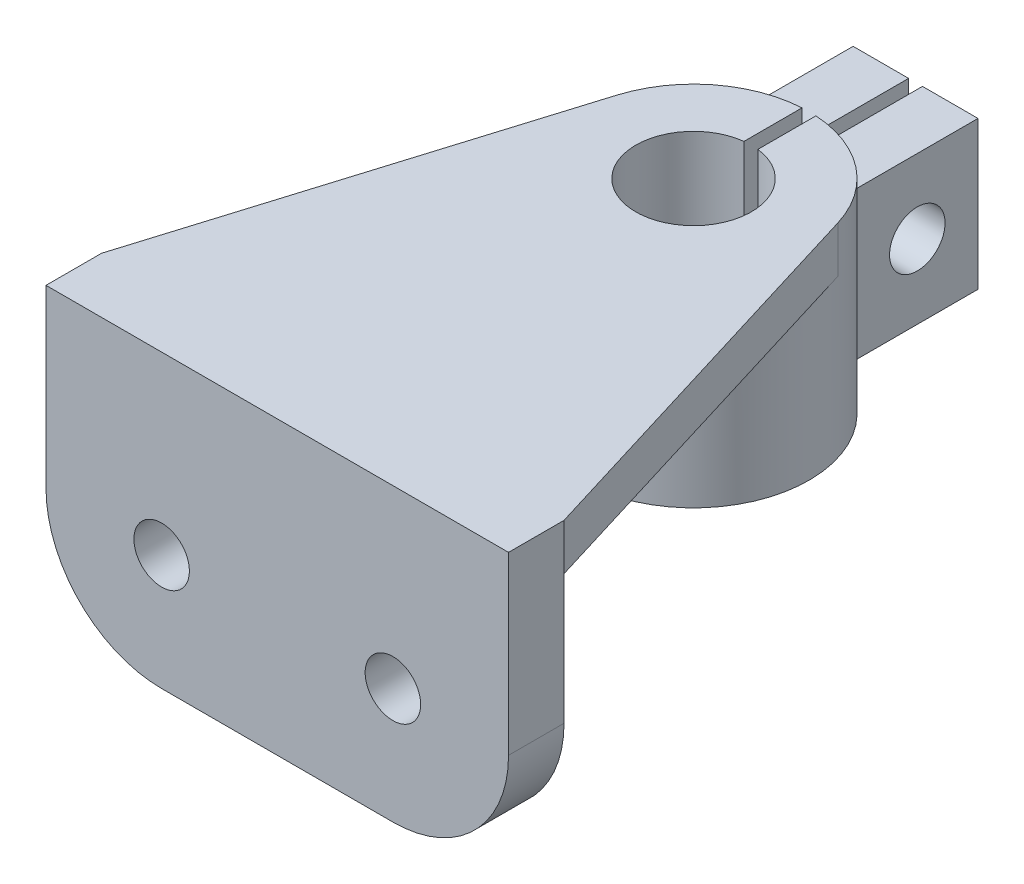
ISO-10303-21;
HEADER;
FILE_DESCRIPTION(('STEP AP214'),'2;1');
FILE_NAME('part.step','',(''),(''),'','','');
FILE_SCHEMA(('AUTOMOTIVE_DESIGN { 1 0 10303 214 1 1 1 1 }'));
ENDSEC;
DATA;
#1=APPLICATION_CONTEXT('core data for automotive mechanical design processes');
#2=APPLICATION_PROTOCOL_DEFINITION('international standard','automotive_design',2000,#1);
#3=PRODUCT_CONTEXT('',#1,'mechanical');
#4=PRODUCT('Part','Part','',(#3));
#5=PRODUCT_RELATED_PRODUCT_CATEGORY('part','',(#4));
#6=PRODUCT_DEFINITION_FORMATION('','',#4);
#7=PRODUCT_DEFINITION_CONTEXT('part definition',#1,'design');
#8=PRODUCT_DEFINITION('design','',#6,#7);
#9=PRODUCT_DEFINITION_SHAPE('','',#8);
#10=(LENGTH_UNIT() NAMED_UNIT(*) SI_UNIT(.MILLI.,.METRE.));
#11=(NAMED_UNIT(*) PLANE_ANGLE_UNIT() SI_UNIT($,.RADIAN.));
#12=(NAMED_UNIT(*) SI_UNIT($,.STERADIAN.) SOLID_ANGLE_UNIT());
#13=UNCERTAINTY_MEASURE_WITH_UNIT(LENGTH_MEASURE(1.E-05),#10,'distance_accuracy_value','');
#14=(GEOMETRIC_REPRESENTATION_CONTEXT(3) GLOBAL_UNCERTAINTY_ASSIGNED_CONTEXT((#13)) GLOBAL_UNIT_ASSIGNED_CONTEXT((#10,
#11,#12)) REPRESENTATION_CONTEXT('',''));
#15=CARTESIAN_POINT('',(0.,0.,0.));
#16=DIRECTION('',(0.,0.,1.));
#17=DIRECTION('',(1.,0.,0.));
#18=AXIS2_PLACEMENT_3D('',#15,#16,#17);
#19=CARTESIAN_POINT('',(0.,21.5,0.));
#20=DIRECTION('',(0.,1.,0.));
#21=DIRECTION('',(-1.,0.,0.));
#22=AXIS2_PLACEMENT_3D('',#19,#20,#21);
#23=PLANE('',#22);
#24=DIRECTION('',(0.,0.,1.));
#25=VECTOR('',#24,1.);
#26=CARTESIAN_POINT('',(2.5,21.5,0.));
#27=LINE('',#26,#25);
#28=CARTESIAN_POINT('',(2.5,21.5,-53.1253140723345));
#29=VERTEX_POINT('',#28);
#30=CARTESIAN_POINT('',(2.5,21.5,0.));
#31=VERTEX_POINT('',#30);
#32=EDGE_CURVE('E241',#29,#31,#27,.T.);
#33=ORIENTED_EDGE('',*,*,#32,.F.);
#34=CARTESIAN_POINT('',(0.,21.5,-78.));
#35=DIRECTION('',(0.,1.,0.));
#36=DIRECTION('',(-1.,0.,0.));
#37=AXIS2_PLACEMENT_3D('',#34,#35,#36);
#38=CIRCLE('',#37,25.);
#39=CARTESIAN_POINT('',(23.9067793629531,21.5,-85.3120380531751));
#40=VERTEX_POINT('',#39);
#41=EDGE_CURVE('E420',#29,#40,#38,.T.);
#42=ORIENTED_EDGE('',*,*,#41,.T.);
#43=DIRECTION('',(0.292481522127003,0.,0.956271174518124));
#44=VECTOR('',#43,1.);
#45=CARTESIAN_POINT('',(45.7227279607136,21.5,-13.9845824344619));
#46=LINE('',#45,#44);
#47=CARTESIAN_POINT('',(50.,21.5,0.));
#48=VERTEX_POINT('',#47);
#49=EDGE_CURVE('E345',#40,#48,#46,.T.);
#50=ORIENTED_EDGE('',*,*,#49,.T.);
#51=DIRECTION('',(-1.,0.,0.));
#52=VECTOR('',#51,1.);
#53=CARTESIAN_POINT('',(0.,21.5,0.));
#54=LINE('',#53,#52);
#55=EDGE_CURVE('E342',#48,#31,#54,.T.);
#56=ORIENTED_EDGE('',*,*,#55,.T.);
#57=EDGE_LOOP('',(#33,#42,#50,#56));
#58=FACE_BOUND('',#57,.T.);
#59=ADVANCED_FACE('F35',(#58),#23,.F.);
#60=CARTESIAN_POINT('',(0.,21.5,-78.));
#61=DIRECTION('',(0.,1.,0.));
#62=DIRECTION('',(-1.,0.,0.));
#63=AXIS2_PLACEMENT_3D('',#60,#61,#62);
#64=CYLINDRICAL_SURFACE('',#63,25.);
#65=ORIENTED_EDGE('',*,*,#41,.F.);
#66=DIRECTION('',(0.,1.,0.));
#67=VECTOR('',#66,1.);
#68=CARTESIAN_POINT('',(2.5,21.5,-53.1253140723345));
#69=LINE('',#68,#67);
#70=CARTESIAN_POINT('',(2.5,-12.5,-53.1253140723345));
#71=VERTEX_POINT('',#70);
#72=EDGE_CURVE('E232',#71,#29,#69,.T.);
#73=ORIENTED_EDGE('',*,*,#72,.F.);
#74=CARTESIAN_POINT('',(0.,-12.5,-78.));
#75=DIRECTION('',(0.,1.,0.));
#76=DIRECTION('',(-1.,0.,0.));
#77=AXIS2_PLACEMENT_3D('',#74,#75,#76);
#78=CIRCLE('',#77,25.);
#79=CARTESIAN_POINT('',(1.5,-12.5,-102.954959426936));
#80=VERTEX_POINT('',#79);
#81=EDGE_CURVE('E228',#71,#80,#78,.T.);
#82=ORIENTED_EDGE('',*,*,#81,.T.);
#83=DIRECTION('',(0.,1.,0.));
#84=VECTOR('',#83,1.);
#85=CARTESIAN_POINT('',(1.5,21.5,-102.954959426936));
#86=LINE('',#85,#84);
#87=CARTESIAN_POINT('',(1.5,-6.50000000000001,-102.954959426936));
#88=VERTEX_POINT('',#87);
#89=EDGE_CURVE('E288',#80,#88,#86,.T.);
#90=ORIENTED_EDGE('',*,*,#89,.T.);
#91=CARTESIAN_POINT('',(0.,-6.50000000000001,-78.));
#92=DIRECTION('',(0.,-1.,0.));
#93=DIRECTION('',(1.,0.,0.));
#94=AXIS2_PLACEMENT_3D('',#91,#92,#93);
#95=CIRCLE('',#94,25.);
#96=CARTESIAN_POINT('',(13.5,-6.50000000000001,-99.0416254125008));
#97=VERTEX_POINT('',#96);
#98=EDGE_CURVE('E328',#88,#97,#95,.T.);
#99=ORIENTED_EDGE('',*,*,#98,.T.);
#100=DIRECTION('',(0.,1.,0.));
#101=VECTOR('',#100,1.);
#102=CARTESIAN_POINT('',(13.5,21.5,-99.0416254125008));
#103=LINE('',#102,#101);
#104=CARTESIAN_POINT('',(13.5,25.5,-99.0416254125008));
#105=VERTEX_POINT('',#104);
#106=EDGE_CURVE('E310',#97,#105,#103,.T.);
#107=ORIENTED_EDGE('',*,*,#106,.T.);
#108=CARTESIAN_POINT('',(0.,25.5,-78.));
#109=DIRECTION('',(0.,1.,0.));
#110=DIRECTION('',(-1.,0.,0.));
#111=AXIS2_PLACEMENT_3D('',#108,#109,#110);
#112=CIRCLE('',#111,25.);
#113=CARTESIAN_POINT('',(1.49999999999999,25.5,-102.954959426936));
#114=VERTEX_POINT('',#113);
#115=EDGE_CURVE('E318',#105,#114,#112,.T.);
#116=ORIENTED_EDGE('',*,*,#115,.T.);
#117=CARTESIAN_POINT('',(1.49999999999999,31.5,-102.954959426936));
#118=VERTEX_POINT('',#117);
#119=EDGE_CURVE('E285',#114,#118,#86,.T.);
#120=ORIENTED_EDGE('',*,*,#119,.T.);
#121=CARTESIAN_POINT('',(0.,31.5,-78.));
#122=DIRECTION('',(0.,1.,0.));
#123=DIRECTION('',(-1.,0.,0.));
#124=AXIS2_PLACEMENT_3D('',#121,#122,#123);
#125=CIRCLE('',#124,25.);
#126=CARTESIAN_POINT('',(23.9067793629531,31.5,-85.3120380531751));
#127=VERTEX_POINT('',#126);
#128=EDGE_CURVE('E349',#127,#118,#125,.T.);
#129=ORIENTED_EDGE('',*,*,#128,.F.);
#130=DIRECTION('',(0.,1.,0.));
#131=VECTOR('',#130,1.);
#132=CARTESIAN_POINT('',(23.9067793629531,21.5,-85.3120380531751));
#133=LINE('',#132,#131);
#134=EDGE_CURVE('E357',#40,#127,#133,.T.);
#135=ORIENTED_EDGE('',*,*,#134,.F.);
#136=EDGE_LOOP('',(#65,#73,#82,#90,#99,#107,#116,#120,#129,#135));
#137=FACE_BOUND('',#136,.T.);
#138=ADVANCED_FACE('F464',(#137),#64,.T.);
#139=DIRECTION('',(0.,0.,1.));
#140=VECTOR('',#139,1.);
#141=CARTESIAN_POINT('',(-2.5,21.5,-126.001));
#142=LINE('',#141,#140);
#143=CARTESIAN_POINT('',(-2.5,21.5,-53.1253140723345));
#144=VERTEX_POINT('',#143);
#145=CARTESIAN_POINT('',(-2.5,21.5,0.));
#146=VERTEX_POINT('',#145);
#147=EDGE_CURVE('E239',#144,#146,#142,.T.);
#148=ORIENTED_EDGE('',*,*,#147,.T.);
#149=CARTESIAN_POINT('',(-50.,21.5,0.));
#150=VERTEX_POINT('',#149);
#151=EDGE_CURVE('E340',#146,#150,#54,.T.);
#152=ORIENTED_EDGE('',*,*,#151,.T.);
#153=DIRECTION('',(0.292481522127002,0.,-0.956271174518124));
#154=VECTOR('',#153,1.);
#155=CARTESIAN_POINT('',(-45.7227279607136,21.5,-13.9845824344618));
#156=LINE('',#155,#154);
#157=CARTESIAN_POINT('',(-23.9067793629531,21.5,-85.3120380531751));
#158=VERTEX_POINT('',#157);
#159=EDGE_CURVE('E337',#150,#158,#156,.T.);
#160=ORIENTED_EDGE('',*,*,#159,.T.);
#161=EDGE_CURVE('E421',#158,#144,#38,.T.);
#162=ORIENTED_EDGE('',*,*,#161,.T.);
#163=EDGE_LOOP('',(#148,#152,#160,#162));
#164=FACE_BOUND('',#163,.T.);
#165=ADVANCED_FACE('F467',(#164),#23,.F.);
#166=CARTESIAN_POINT('',(25.,-6.50000000000001,0.));
#167=DIRECTION('',(0.,0.,1.));
#168=DIRECTION('',(1.,0.,0.));
#169=AXIS2_PLACEMENT_3D('',#166,#167,#168);
#170=PLANE('',#169);
#171=CARTESIAN_POINT('',(-25.,-6.50000000000002,0.));
#172=DIRECTION('',(0.,0.,1.));
#173=DIRECTION('',(1.,0.,0.));
#174=AXIS2_PLACEMENT_3D('',#171,#172,#173);
#175=CIRCLE('',#174,6.);
#176=CARTESIAN_POINT('',(-19.,-6.50000000000002,0.));
#177=VERTEX_POINT('',#176);
#178=EDGE_CURVE('E364',#177,#177,#175,.T.);
#179=ORIENTED_EDGE('',*,*,#178,.T.);
#180=EDGE_LOOP('',(#179));
#181=FACE_BOUND('',#180,.T.);
#182=DIRECTION('',(0.,-1.,0.));
#183=VECTOR('',#182,1.);
#184=CARTESIAN_POINT('',(-2.5,-31.5,0.));
#185=LINE('',#184,#183);
#186=CARTESIAN_POINT('',(-2.5,-31.5,0.));
#187=VERTEX_POINT('',#186);
#188=EDGE_CURVE('E245',#146,#187,#185,.T.);
#189=ORIENTED_EDGE('',*,*,#188,.T.);
#190=DIRECTION('',(1.,0.,0.));
#191=VECTOR('',#190,1.);
#192=CARTESIAN_POINT('',(24.9999999999998,-31.5,0.));
#193=LINE('',#192,#191);
#194=CARTESIAN_POINT('',(-24.9999999999998,-31.5,0.));
#195=VERTEX_POINT('',#194);
#196=EDGE_CURVE('E397',#195,#187,#193,.T.);
#197=ORIENTED_EDGE('',*,*,#196,.F.);
#198=CARTESIAN_POINT('',(-25.,-6.50000000000002,0.));
#199=DIRECTION('',(0.,0.,1.));
#200=DIRECTION('',(-1.,0.,0.));
#201=AXIS2_PLACEMENT_3D('',#198,#199,#200);
#202=CIRCLE('',#201,25.);
#203=CARTESIAN_POINT('',(-50.,-6.50000000000002,0.));
#204=VERTEX_POINT('',#203);
#205=EDGE_CURVE('E394',#204,#195,#202,.T.);
#206=ORIENTED_EDGE('',*,*,#205,.F.);
#207=DIRECTION('',(0.,-1.,0.));
#208=VECTOR('',#207,1.);
#209=CARTESIAN_POINT('',(-50.,-6.49999999999984,0.));
#210=LINE('',#209,#208);
#211=EDGE_CURVE('E367',#150,#204,#210,.T.);
#212=ORIENTED_EDGE('',*,*,#211,.F.);
#213=ORIENTED_EDGE('',*,*,#151,.F.);
#214=EDGE_LOOP('',(#189,#197,#206,#212,#213));
#215=FACE_BOUND('',#214,.T.);
#216=ADVANCED_FACE('F476',(#181,#215),#170,.F.);
#217=CARTESIAN_POINT('',(-1.5,-12.5,-102.954959426936));
#218=VERTEX_POINT('',#217);
#219=CARTESIAN_POINT('',(-2.5,-12.5,-53.1253140723345));
#220=VERTEX_POINT('',#219);
#221=EDGE_CURVE('E51',#218,#220,#78,.T.);
#222=ORIENTED_EDGE('',*,*,#221,.T.);
#223=DIRECTION('',(0.,1.,0.));
#224=VECTOR('',#223,1.);
#225=CARTESIAN_POINT('',(-2.5,21.5,-53.1253140723345));
#226=LINE('',#225,#224);
#227=EDGE_CURVE('E249',#144,#220,#226,.F.);
#228=ORIENTED_EDGE('',*,*,#227,.F.);
#229=ORIENTED_EDGE('',*,*,#161,.F.);
#230=DIRECTION('',(0.,1.,0.));
#231=VECTOR('',#230,1.);
#232=CARTESIAN_POINT('',(-23.9067793629531,21.5,-85.3120380531751));
#233=LINE('',#232,#231);
#234=CARTESIAN_POINT('',(-23.9067793629531,31.5,-85.3120380531751));
#235=VERTEX_POINT('',#234);
#236=EDGE_CURVE('E348',#158,#235,#233,.T.);
#237=ORIENTED_EDGE('',*,*,#236,.T.);
#238=CARTESIAN_POINT('',(-1.5,31.5,-102.954959426936));
#239=VERTEX_POINT('',#238);
#240=EDGE_CURVE('E336',#239,#235,#125,.T.);
#241=ORIENTED_EDGE('',*,*,#240,.F.);
#242=DIRECTION('',(0.,1.,0.));
#243=VECTOR('',#242,1.);
#244=CARTESIAN_POINT('',(-1.5,21.5,-102.954959426936));
#245=LINE('',#244,#243);
#246=CARTESIAN_POINT('',(-1.5,25.5,-102.954959426936));
#247=VERTEX_POINT('',#246);
#248=EDGE_CURVE('E270',#247,#239,#245,.T.);
#249=ORIENTED_EDGE('',*,*,#248,.F.);
#250=CARTESIAN_POINT('',(-13.5,25.5,-99.0416254125008));
#251=VERTEX_POINT('',#250);
#252=EDGE_CURVE('E322',#247,#251,#112,.T.);
#253=ORIENTED_EDGE('',*,*,#252,.T.);
#254=DIRECTION('',(0.,1.,0.));
#255=VECTOR('',#254,1.);
#256=CARTESIAN_POINT('',(-13.5,21.5,-99.0416254125008));
#257=LINE('',#256,#255);
#258=CARTESIAN_POINT('',(-13.5,-6.5,-99.0416254125008));
#259=VERTEX_POINT('',#258);
#260=EDGE_CURVE('E323',#251,#259,#257,.F.);
#261=ORIENTED_EDGE('',*,*,#260,.T.);
#262=CARTESIAN_POINT('',(-1.5,-6.50000000000001,-102.954959426936));
#263=VERTEX_POINT('',#262);
#264=EDGE_CURVE('E325',#259,#263,#95,.T.);
#265=ORIENTED_EDGE('',*,*,#264,.T.);
#266=EDGE_CURVE('E272',#218,#263,#245,.T.);
#267=ORIENTED_EDGE('',*,*,#266,.F.);
#268=EDGE_LOOP('',(#222,#228,#229,#237,#241,#249,#253,#261,#265,#267));
#269=FACE_BOUND('',#268,.T.);
#270=ADVANCED_FACE('F430',(#269),#64,.T.);
#271=CARTESIAN_POINT('',(50.,31.5,12.));
#272=DIRECTION('',(0.,-1.,0.));
#273=DIRECTION('',(1.,0.,0.));
#274=AXIS2_PLACEMENT_3D('',#271,#272,#273);
#275=PLANE('',#274);
#276=DIRECTION('',(0.,0.,1.));
#277=VECTOR('',#276,1.);
#278=CARTESIAN_POINT('',(1.49999999999999,31.5,-126.3155629423));
#279=LINE('',#278,#277);
#280=CARTESIAN_POINT('',(1.49999999999999,31.5,-90.4096736459908));
#281=VERTEX_POINT('',#280);
#282=EDGE_CURVE('E264',#118,#281,#279,.T.);
#283=ORIENTED_EDGE('',*,*,#282,.T.);
#284=CARTESIAN_POINT('',(0.,31.5,-78.));
#285=DIRECTION('',(0.,-1.,0.));
#286=DIRECTION('',(1.,0.,0.));
#287=AXIS2_PLACEMENT_3D('',#284,#285,#286);
#288=CIRCLE('',#287,12.5);
#289=CARTESIAN_POINT('',(-1.5,31.5,-90.4096736459908));
#290=VERTEX_POINT('',#289);
#291=EDGE_CURVE('E330',#281,#290,#288,.T.);
#292=ORIENTED_EDGE('',*,*,#291,.T.);
#293=DIRECTION('',(0.,0.,1.));
#294=VECTOR('',#293,1.);
#295=CARTESIAN_POINT('',(-1.5,31.5,-126.3155629423));
#296=LINE('',#295,#294);
#297=EDGE_CURVE('E262',#239,#290,#296,.T.);
#298=ORIENTED_EDGE('',*,*,#297,.F.);
#299=ORIENTED_EDGE('',*,*,#240,.T.);
#300=DIRECTION('',(0.292481522127002,0.,-0.956271174518124));
#301=VECTOR('',#300,1.);
#302=CARTESIAN_POINT('',(-45.7227279607136,31.5,-13.9845824344618));
#303=LINE('',#302,#301);
#304=CARTESIAN_POINT('',(-50.,31.5,0.));
#305=VERTEX_POINT('',#304);
#306=EDGE_CURVE('E352',#305,#235,#303,.T.);
#307=ORIENTED_EDGE('',*,*,#306,.F.);
#308=DIRECTION('',(0.,0.,-1.));
#309=VECTOR('',#308,1.);
#310=CARTESIAN_POINT('',(-50.,31.5,12.));
#311=LINE('',#310,#309);
#312=CARTESIAN_POINT('',(-50.,31.5,12.));
#313=VERTEX_POINT('',#312);
#314=EDGE_CURVE('E390',#313,#305,#311,.T.);
#315=ORIENTED_EDGE('',*,*,#314,.F.);
#316=DIRECTION('',(-1.,0.,0.));
#317=VECTOR('',#316,1.);
#318=CARTESIAN_POINT('',(50.,31.5,12.));
#319=LINE('',#318,#317);
#320=CARTESIAN_POINT('',(50.,31.5,12.));
#321=VERTEX_POINT('',#320);
#322=EDGE_CURVE('E388',#321,#313,#319,.T.);
#323=ORIENTED_EDGE('',*,*,#322,.F.);
#324=DIRECTION('',(0.,0.,-1.));
#325=VECTOR('',#324,1.);
#326=CARTESIAN_POINT('',(50.,31.5,12.));
#327=LINE('',#326,#325);
#328=CARTESIAN_POINT('',(50.,31.5,0.));
#329=VERTEX_POINT('',#328);
#330=EDGE_CURVE('E405',#321,#329,#327,.T.);
#331=ORIENTED_EDGE('',*,*,#330,.T.);
#332=DIRECTION('',(0.292481522127003,0.,0.956271174518124));
#333=VECTOR('',#332,1.);
#334=CARTESIAN_POINT('',(45.7227279607136,31.5,-13.9845824344619));
#335=LINE('',#334,#333);
#336=EDGE_CURVE('E341',#127,#329,#335,.T.);
#337=ORIENTED_EDGE('',*,*,#336,.F.);
#338=ORIENTED_EDGE('',*,*,#128,.T.);
#339=EDGE_LOOP('',(#283,#292,#298,#299,#307,#315,#323,#331,#337,#338));
#340=FACE_BOUND('',#339,.T.);
#341=ADVANCED_FACE('F510',(#340),#275,.F.);
#342=CARTESIAN_POINT('',(0.,-12.5,-78.));
#343=DIRECTION('',(0.,1.,0.));
#344=DIRECTION('',(-1.,0.,0.));
#345=AXIS2_PLACEMENT_3D('',#342,#343,#344);
#346=PLANE('',#345);
#347=DIRECTION('',(0.,0.,1.));
#348=VECTOR('',#347,1.);
#349=CARTESIAN_POINT('',(1.5,-12.5,-78.));
#350=LINE('',#349,#348);
#351=CARTESIAN_POINT('',(1.5,-12.5,-90.4096736459908));
#352=VERTEX_POINT('',#351);
#353=EDGE_CURVE('E289',#80,#352,#350,.T.);
#354=ORIENTED_EDGE('',*,*,#353,.F.);
#355=ORIENTED_EDGE('',*,*,#81,.F.);
#356=DIRECTION('',(0.,0.,1.));
#357=VECTOR('',#356,1.);
#358=CARTESIAN_POINT('',(2.5,-12.5,-126.001));
#359=LINE('',#358,#357);
#360=CARTESIAN_POINT('',(2.5,-12.5,-53.));
#361=VERTEX_POINT('',#360);
#362=EDGE_CURVE('E225',#71,#361,#359,.T.);
#363=ORIENTED_EDGE('',*,*,#362,.T.);
#364=DIRECTION('',(-1.,0.,0.));
#365=VECTOR('',#364,1.);
#366=CARTESIAN_POINT('',(2.5,-12.5,-53.));
#367=LINE('',#366,#365);
#368=CARTESIAN_POINT('',(-2.5,-12.5,-53.));
#369=VERTEX_POINT('',#368);
#370=EDGE_CURVE('E211',#361,#369,#367,.T.);
#371=ORIENTED_EDGE('',*,*,#370,.T.);
#372=DIRECTION('',(0.,0.,1.));
#373=VECTOR('',#372,1.);
#374=CARTESIAN_POINT('',(-2.5,-12.5,-126.001));
#375=LINE('',#374,#373);
#376=EDGE_CURVE('E222',#220,#369,#375,.T.);
#377=ORIENTED_EDGE('',*,*,#376,.F.);
#378=ORIENTED_EDGE('',*,*,#221,.F.);
#379=DIRECTION('',(0.,0.,1.));
#380=VECTOR('',#379,1.);
#381=CARTESIAN_POINT('',(-1.5,-12.5,-78.));
#382=LINE('',#381,#380);
#383=CARTESIAN_POINT('',(-1.5,-12.5,-90.4096736459908));
#384=VERTEX_POINT('',#383);
#385=EDGE_CURVE('E273',#218,#384,#382,.T.);
#386=ORIENTED_EDGE('',*,*,#385,.T.);
#387=CARTESIAN_POINT('',(0.,-12.5,-78.));
#388=DIRECTION('',(0.,-1.,0.));
#389=DIRECTION('',(1.,0.,0.));
#390=AXIS2_PLACEMENT_3D('',#387,#388,#389);
#391=CIRCLE('',#390,12.5);
#392=EDGE_CURVE('E321',#352,#384,#391,.T.);
#393=ORIENTED_EDGE('',*,*,#392,.F.);
#394=EDGE_LOOP('',(#354,#355,#363,#371,#377,#378,#386,#393));
#395=FACE_BOUND('',#394,.T.);
#396=ADVANCED_FACE('F227',(#395),#346,.F.);
#397=CARTESIAN_POINT('',(0.,31.5,-78.));
#398=DIRECTION('',(0.,-1.,0.));
#399=DIRECTION('',(1.,0.,0.));
#400=AXIS2_PLACEMENT_3D('',#397,#398,#399);
#401=CYLINDRICAL_SURFACE('',#400,12.5);
#402=DIRECTION('',(0.,-1.,0.));
#403=VECTOR('',#402,1.);
#404=CARTESIAN_POINT('',(1.49999999999999,31.5,-90.4096736459908));
#405=LINE('',#404,#403);
#406=EDGE_CURVE('E291',#352,#281,#405,.F.);
#407=ORIENTED_EDGE('',*,*,#406,.F.);
#408=ORIENTED_EDGE('',*,*,#392,.T.);
#409=DIRECTION('',(0.,-1.,0.));
#410=VECTOR('',#409,1.);
#411=CARTESIAN_POINT('',(-1.5,31.5,-90.4096736459908));
#412=LINE('',#411,#410);
#413=EDGE_CURVE('E276',#384,#290,#412,.F.);
#414=ORIENTED_EDGE('',*,*,#413,.T.);
#415=ORIENTED_EDGE('',*,*,#291,.F.);
#416=EDGE_LOOP('',(#407,#408,#414,#415));
#417=FACE_BOUND('',#416,.T.);
#418=ADVANCED_FACE('F504',(#417),#401,.F.);
#419=CARTESIAN_POINT('',(-13.5,-6.5,12.002));
#420=DIRECTION('',(0.,-1.,0.));
#421=DIRECTION('',(1.,0.,0.));
#422=AXIS2_PLACEMENT_3D('',#419,#420,#421);
#423=PLANE('',#422);
#424=ORIENTED_EDGE('',*,*,#98,.F.);
#425=DIRECTION('',(0.,0.,-1.));
#426=VECTOR('',#425,1.);
#427=CARTESIAN_POINT('',(1.5,-6.50000000000001,12.002));
#428=LINE('',#427,#426);
#429=CARTESIAN_POINT('',(1.5,-6.50000000000001,-126.));
#430=VERTEX_POINT('',#429);
#431=EDGE_CURVE('E282',#88,#430,#428,.T.);
#432=ORIENTED_EDGE('',*,*,#431,.T.);
#433=DIRECTION('',(-1.,0.,0.));
#434=VECTOR('',#433,1.);
#435=CARTESIAN_POINT('',(-13.5,-6.5,-126.));
#436=LINE('',#435,#434);
#437=CARTESIAN_POINT('',(13.5,-6.50000000000001,-126.));
#438=VERTEX_POINT('',#437);
#439=EDGE_CURVE('E302',#438,#430,#436,.T.);
#440=ORIENTED_EDGE('',*,*,#439,.F.);
#441=DIRECTION('',(0.,0.,-1.));
#442=VECTOR('',#441,1.);
#443=CARTESIAN_POINT('',(13.5,-6.50000000000001,12.002));
#444=LINE('',#443,#442);
#445=EDGE_CURVE('E308',#97,#438,#444,.T.);
#446=ORIENTED_EDGE('',*,*,#445,.F.);
#447=EDGE_LOOP('',(#424,#432,#440,#446));
#448=FACE_BOUND('',#447,.T.);
#449=ADVANCED_FACE('F461',(#448),#423,.T.);
#450=CARTESIAN_POINT('',(0.,0.,-126.));
#451=DIRECTION('',(0.,0.,-1.));
#452=DIRECTION('',(-1.,0.,0.));
#453=AXIS2_PLACEMENT_3D('',#450,#451,#452);
#454=PLANE('',#453);
#455=ORIENTED_EDGE('',*,*,#439,.T.);
#456=DIRECTION('',(0.,1.,0.));
#457=VECTOR('',#456,1.);
#458=CARTESIAN_POINT('',(1.5,0.,-126.));
#459=LINE('',#458,#457);
#460=CARTESIAN_POINT('',(1.49999999999999,25.5,-126.));
#461=VERTEX_POINT('',#460);
#462=EDGE_CURVE('E279',#430,#461,#459,.T.);
#463=ORIENTED_EDGE('',*,*,#462,.T.);
#464=DIRECTION('',(1.,0.,0.));
#465=VECTOR('',#464,1.);
#466=CARTESIAN_POINT('',(-13.5,25.5,-126.));
#467=LINE('',#466,#465);
#468=CARTESIAN_POINT('',(13.5,25.5,-126.));
#469=VERTEX_POINT('',#468);
#470=EDGE_CURVE('E298',#461,#469,#467,.T.);
#471=ORIENTED_EDGE('',*,*,#470,.T.);
#472=DIRECTION('',(0.,-1.,0.));
#473=VECTOR('',#472,1.);
#474=CARTESIAN_POINT('',(13.5,-6.50000000000001,-126.));
#475=LINE('',#474,#473);
#476=EDGE_CURVE('E293',#469,#438,#475,.T.);
#477=ORIENTED_EDGE('',*,*,#476,.T.);
#478=EDGE_LOOP('',(#455,#463,#471,#477));
#479=FACE_BOUND('',#478,.T.);
#480=ADVANCED_FACE('F448',(#479),#454,.T.);
#481=CARTESIAN_POINT('',(-13.5,25.5,12.002));
#482=DIRECTION('',(0.,1.,0.));
#483=DIRECTION('',(-1.,0.,0.));
#484=AXIS2_PLACEMENT_3D('',#481,#482,#483);
#485=PLANE('',#484);
#486=ORIENTED_EDGE('',*,*,#470,.F.);
#487=DIRECTION('',(0.,0.,1.));
#488=VECTOR('',#487,1.);
#489=CARTESIAN_POINT('',(1.49999999999999,25.5,12.002));
#490=LINE('',#489,#488);
#491=EDGE_CURVE('E11',#461,#114,#490,.T.);
#492=ORIENTED_EDGE('',*,*,#491,.T.);
#493=ORIENTED_EDGE('',*,*,#115,.F.);
#494=DIRECTION('',(0.,0.,-1.));
#495=VECTOR('',#494,1.);
#496=CARTESIAN_POINT('',(13.5,25.5,12.002));
#497=LINE('',#496,#495);
#498=EDGE_CURVE('E305',#105,#469,#497,.T.);
#499=ORIENTED_EDGE('',*,*,#498,.T.);
#500=EDGE_LOOP('',(#486,#492,#493,#499));
#501=FACE_BOUND('',#500,.T.);
#502=ADVANCED_FACE('F460',(#501),#485,.T.);
#503=CARTESIAN_POINT('',(25.,-6.50000000000001,0.));
#504=DIRECTION('',(0.,0.,1.));
#505=DIRECTION('',(1.,0.,0.));
#506=AXIS2_PLACEMENT_3D('',#503,#504,#505);
#507=CIRCLE('',#506,6.);
#508=CARTESIAN_POINT('',(31.,-6.50000000000001,0.));
#509=VERTEX_POINT('',#508);
#510=EDGE_CURVE('E371',#509,#509,#507,.T.);
#511=ORIENTED_EDGE('',*,*,#510,.T.);
#512=EDGE_LOOP('',(#511));
#513=FACE_BOUND('',#512,.T.);
#514=CARTESIAN_POINT('',(2.5,-31.5,0.));
#515=VERTEX_POINT('',#514);
#516=CARTESIAN_POINT('',(24.9999999999998,-31.5,0.));
#517=VERTEX_POINT('',#516);
#518=EDGE_CURVE('E396',#515,#517,#193,.T.);
#519=ORIENTED_EDGE('',*,*,#518,.F.);
#520=DIRECTION('',(0.,-1.,0.));
#521=VECTOR('',#520,1.);
#522=CARTESIAN_POINT('',(2.5,-31.5,0.));
#523=LINE('',#522,#521);
#524=EDGE_CURVE('E236',#31,#515,#523,.T.);
#525=ORIENTED_EDGE('',*,*,#524,.F.);
#526=ORIENTED_EDGE('',*,*,#55,.F.);
#527=DIRECTION('',(0.,1.,0.));
#528=VECTOR('',#527,1.);
#529=CARTESIAN_POINT('',(50.,-6.49999999999983,0.));
#530=LINE('',#529,#528);
#531=CARTESIAN_POINT('',(50.,-6.49999999999983,0.));
#532=VERTEX_POINT('',#531);
#533=EDGE_CURVE('E380',#532,#48,#530,.T.);
#534=ORIENTED_EDGE('',*,*,#533,.F.);
#535=CARTESIAN_POINT('',(25.,-6.50000000000001,0.));
#536=DIRECTION('',(0.,0.,1.));
#537=DIRECTION('',(1.,0.,0.));
#538=AXIS2_PLACEMENT_3D('',#535,#536,#537);
#539=CIRCLE('',#538,25.);
#540=EDGE_CURVE('E400',#517,#532,#539,.T.);
#541=ORIENTED_EDGE('',*,*,#540,.F.);
#542=EDGE_LOOP('',(#519,#525,#526,#534,#541));
#543=FACE_BOUND('',#542,.T.);
#544=ADVANCED_FACE('F483',(#513,#543),#170,.F.);
#545=CARTESIAN_POINT('',(-50.,-6.49999999999984,12.));
#546=DIRECTION('',(1.,0.,0.));
#547=DIRECTION('',(0.,0.,-1.));
#548=AXIS2_PLACEMENT_3D('',#545,#546,#547);
#549=PLANE('',#548);
#550=EDGE_CURVE('E391',#305,#150,#210,.T.);
#551=ORIENTED_EDGE('',*,*,#550,.T.);
#552=ORIENTED_EDGE('',*,*,#211,.T.);
#553=DIRECTION('',(0.,0.,-1.));
#554=VECTOR('',#553,1.);
#555=CARTESIAN_POINT('',(-50.,-6.50000000000002,12.));
#556=LINE('',#555,#554);
#557=CARTESIAN_POINT('',(-50.,-6.50000000000002,12.));
#558=VERTEX_POINT('',#557);
#559=EDGE_CURVE('E417',#558,#204,#556,.T.);
#560=ORIENTED_EDGE('',*,*,#559,.F.);
#561=DIRECTION('',(0.,-1.,0.));
#562=VECTOR('',#561,1.);
#563=CARTESIAN_POINT('',(-50.,-6.49999999999984,12.));
#564=LINE('',#563,#562);
#565=EDGE_CURVE('E376',#313,#558,#564,.T.);
#566=ORIENTED_EDGE('',*,*,#565,.F.);
#567=ORIENTED_EDGE('',*,*,#314,.T.);
#568=EDGE_LOOP('',(#551,#552,#560,#566,#567));
#569=FACE_BOUND('',#568,.T.);
#570=ADVANCED_FACE('F37',(#569),#549,.F.);
#571=CARTESIAN_POINT('',(-25.,-6.50000000000002,12.));
#572=DIRECTION('',(0.,0.,-1.));
#573=DIRECTION('',(-1.,0.,0.));
#574=AXIS2_PLACEMENT_3D('',#571,#572,#573);
#575=CYLINDRICAL_SURFACE('',#574,25.);
#576=ORIENTED_EDGE('',*,*,#205,.T.);
#577=DIRECTION('',(0.,0.,-1.));
#578=VECTOR('',#577,1.);
#579=CARTESIAN_POINT('',(-24.9999999999998,-31.5,12.));
#580=LINE('',#579,#578);
#581=CARTESIAN_POINT('',(-24.9999999999998,-31.5,12.));
#582=VERTEX_POINT('',#581);
#583=EDGE_CURVE('E414',#582,#195,#580,.T.);
#584=ORIENTED_EDGE('',*,*,#583,.F.);
#585=CARTESIAN_POINT('',(-25.,-6.50000000000002,12.));
#586=DIRECTION('',(0.,0.,1.));
#587=DIRECTION('',(-1.,0.,0.));
#588=AXIS2_PLACEMENT_3D('',#585,#586,#587);
#589=CIRCLE('',#588,25.);
#590=EDGE_CURVE('E379',#558,#582,#589,.T.);
#591=ORIENTED_EDGE('',*,*,#590,.F.);
#592=ORIENTED_EDGE('',*,*,#559,.T.);
#593=EDGE_LOOP('',(#576,#584,#591,#592));
#594=FACE_BOUND('',#593,.T.);
#595=ADVANCED_FACE('F555',(#594),#575,.T.);
#596=CARTESIAN_POINT('',(24.9999999999998,-31.5,12.));
#597=DIRECTION('',(0.,1.,0.));
#598=DIRECTION('',(-1.,0.,0.));
#599=AXIS2_PLACEMENT_3D('',#596,#597,#598);
#600=PLANE('',#599);
#601=ORIENTED_EDGE('',*,*,#196,.T.);
#602=DIRECTION('',(-1.,0.,0.));
#603=VECTOR('',#602,1.);
#604=CARTESIAN_POINT('',(2.5,-31.5,0.));
#605=LINE('',#604,#603);
#606=EDGE_CURVE('E237',#515,#187,#605,.T.);
#607=ORIENTED_EDGE('',*,*,#606,.F.);
#608=ORIENTED_EDGE('',*,*,#518,.T.);
#609=DIRECTION('',(0.,0.,-1.));
#610=VECTOR('',#609,1.);
#611=CARTESIAN_POINT('',(24.9999999999998,-31.5,12.));
#612=LINE('',#611,#610);
#613=CARTESIAN_POINT('',(24.9999999999998,-31.5,12.));
#614=VERTEX_POINT('',#613);
#615=EDGE_CURVE('E411',#614,#517,#612,.T.);
#616=ORIENTED_EDGE('',*,*,#615,.F.);
#617=DIRECTION('',(1.,0.,0.));
#618=VECTOR('',#617,1.);
#619=CARTESIAN_POINT('',(24.9999999999998,-31.5,12.));
#620=LINE('',#619,#618);
#621=EDGE_CURVE('E382',#582,#614,#620,.T.);
#622=ORIENTED_EDGE('',*,*,#621,.F.);
#623=ORIENTED_EDGE('',*,*,#583,.T.);
#624=EDGE_LOOP('',(#601,#607,#608,#616,#622,#623));
#625=FACE_BOUND('',#624,.T.);
#626=ADVANCED_FACE('F552',(#625),#600,.F.);
#627=CARTESIAN_POINT('',(25.,-6.50000000000001,12.));
#628=DIRECTION('',(0.,0.,-1.));
#629=DIRECTION('',(-1.,0.,0.));
#630=AXIS2_PLACEMENT_3D('',#627,#628,#629);
#631=CYLINDRICAL_SURFACE('',#630,25.);
#632=ORIENTED_EDGE('',*,*,#540,.T.);
#633=DIRECTION('',(0.,0.,-1.));
#634=VECTOR('',#633,1.);
#635=CARTESIAN_POINT('',(50.,-6.49999999999983,12.));
#636=LINE('',#635,#634);
#637=CARTESIAN_POINT('',(50.,-6.49999999999983,12.));
#638=VERTEX_POINT('',#637);
#639=EDGE_CURVE('E408',#638,#532,#636,.T.);
#640=ORIENTED_EDGE('',*,*,#639,.F.);
#641=CARTESIAN_POINT('',(25.,-6.50000000000001,12.));
#642=DIRECTION('',(0.,0.,1.));
#643=DIRECTION('',(1.,0.,0.));
#644=AXIS2_PLACEMENT_3D('',#641,#642,#643);
#645=CIRCLE('',#644,25.);
#646=EDGE_CURVE('E384',#614,#638,#645,.T.);
#647=ORIENTED_EDGE('',*,*,#646,.F.);
#648=ORIENTED_EDGE('',*,*,#615,.T.);
#649=EDGE_LOOP('',(#632,#640,#647,#648));
#650=FACE_BOUND('',#649,.T.);
#651=ADVANCED_FACE('F548',(#650),#631,.T.);
#652=CARTESIAN_POINT('',(50.,-6.49999999999983,12.));
#653=DIRECTION('',(-1.,0.,0.));
#654=DIRECTION('',(0.,0.,1.));
#655=AXIS2_PLACEMENT_3D('',#652,#653,#654);
#656=PLANE('',#655);
#657=ORIENTED_EDGE('',*,*,#533,.T.);
#658=DIRECTION('',(0.,1.,0.));
#659=VECTOR('',#658,1.);
#660=CARTESIAN_POINT('',(50.,21.5,0.));
#661=LINE('',#660,#659);
#662=EDGE_CURVE('E360',#48,#329,#661,.T.);
#663=ORIENTED_EDGE('',*,*,#662,.T.);
#664=ORIENTED_EDGE('',*,*,#330,.F.);
#665=DIRECTION('',(0.,1.,0.));
#666=VECTOR('',#665,1.);
#667=CARTESIAN_POINT('',(50.,-6.49999999999983,12.));
#668=LINE('',#667,#666);
#669=EDGE_CURVE('E386',#638,#321,#668,.T.);
#670=ORIENTED_EDGE('',*,*,#669,.F.);
#671=ORIENTED_EDGE('',*,*,#639,.T.);
#672=EDGE_LOOP('',(#657,#663,#664,#670,#671));
#673=FACE_BOUND('',#672,.T.);
#674=ADVANCED_FACE('F538',(#673),#656,.F.);
#675=CARTESIAN_POINT('',(25.,-6.50000000000001,12.));
#676=DIRECTION('',(0.,0.,1.));
#677=DIRECTION('',(1.,0.,0.));
#678=AXIS2_PLACEMENT_3D('',#675,#676,#677);
#679=PLANE('',#678);
#680=CARTESIAN_POINT('',(-25.,-6.50000000000002,12.));
#681=DIRECTION('',(0.,0.,1.));
#682=DIRECTION('',(1.,0.,0.));
#683=AXIS2_PLACEMENT_3D('',#680,#681,#682);
#684=CIRCLE('',#683,6.);
#685=CARTESIAN_POINT('',(-19.,-6.50000000000002,12.));
#686=VERTEX_POINT('',#685);
#687=EDGE_CURVE('E368',#686,#686,#684,.T.);
#688=ORIENTED_EDGE('',*,*,#687,.F.);
#689=EDGE_LOOP('',(#688));
#690=FACE_BOUND('',#689,.T.);
#691=CARTESIAN_POINT('',(25.,-6.50000000000001,12.));
#692=DIRECTION('',(0.,0.,1.));
#693=DIRECTION('',(1.,0.,0.));
#694=AXIS2_PLACEMENT_3D('',#691,#692,#693);
#695=CIRCLE('',#694,6.);
#696=CARTESIAN_POINT('',(31.,-6.50000000000001,12.));
#697=VERTEX_POINT('',#696);
#698=EDGE_CURVE('E359',#697,#697,#695,.T.);
#699=ORIENTED_EDGE('',*,*,#698,.F.);
#700=EDGE_LOOP('',(#699));
#701=FACE_BOUND('',#700,.T.);
#702=ORIENTED_EDGE('',*,*,#565,.T.);
#703=ORIENTED_EDGE('',*,*,#590,.T.);
#704=ORIENTED_EDGE('',*,*,#621,.T.);
#705=ORIENTED_EDGE('',*,*,#646,.T.);
#706=ORIENTED_EDGE('',*,*,#669,.T.);
#707=ORIENTED_EDGE('',*,*,#322,.T.);
#708=EDGE_LOOP('',(#702,#703,#704,#705,#706,#707));
#709=FACE_BOUND('',#708,.T.);
#710=ADVANCED_FACE('F544',(#690,#701,#709),#679,.T.);
#711=CARTESIAN_POINT('',(25.,-6.50000000000001,0.));
#712=DIRECTION('',(0.,0.,1.));
#713=DIRECTION('',(1.,0.,0.));
#714=AXIS2_PLACEMENT_3D('',#711,#712,#713);
#715=CYLINDRICAL_SURFACE('',#714,6.);
#716=ORIENTED_EDGE('',*,*,#510,.F.);
#717=EDGE_LOOP('',(#716));
#718=FACE_BOUND('',#717,.T.);
#719=ORIENTED_EDGE('',*,*,#698,.T.);
#720=EDGE_LOOP('',(#719));
#721=FACE_BOUND('',#720,.T.);
#722=ADVANCED_FACE('F596',(#718,#721),#715,.F.);
#723=CARTESIAN_POINT('',(-25.,-6.50000000000002,0.));
#724=DIRECTION('',(0.,0.,1.));
#725=DIRECTION('',(1.,0.,0.));
#726=AXIS2_PLACEMENT_3D('',#723,#724,#725);
#727=CYLINDRICAL_SURFACE('',#726,6.);
#728=ORIENTED_EDGE('',*,*,#178,.F.);
#729=EDGE_LOOP('',(#728));
#730=FACE_BOUND('',#729,.T.);
#731=ORIENTED_EDGE('',*,*,#687,.T.);
#732=EDGE_LOOP('',(#731));
#733=FACE_BOUND('',#732,.T.);
#734=ADVANCED_FACE('F603',(#730,#733),#727,.F.);
#735=CARTESIAN_POINT('',(45.7227279607136,21.5,-13.9845824344619));
#736=DIRECTION('',(-0.956271174518124,0.,0.292481522127003));
#737=DIRECTION('',(0.292481522127003,0.,0.956271174518124));
#738=AXIS2_PLACEMENT_3D('',#735,#736,#737);
#739=PLANE('',#738);
#740=ORIENTED_EDGE('',*,*,#336,.T.);
#741=ORIENTED_EDGE('',*,*,#662,.F.);
#742=ORIENTED_EDGE('',*,*,#49,.F.);
#743=ORIENTED_EDGE('',*,*,#134,.T.);
#744=EDGE_LOOP('',(#740,#741,#742,#743));
#745=FACE_BOUND('',#744,.T.);
#746=ADVANCED_FACE('F535',(#745),#739,.F.);
#747=CARTESIAN_POINT('',(-45.7227279607136,21.5,-13.9845824344618));
#748=DIRECTION('',(0.956271174518124,0.,0.292481522127002));
#749=DIRECTION('',(0.292481522127002,0.,-0.956271174518124));
#750=AXIS2_PLACEMENT_3D('',#747,#748,#749);
#751=PLANE('',#750);
#752=ORIENTED_EDGE('',*,*,#306,.T.);
#753=ORIENTED_EDGE('',*,*,#236,.F.);
#754=ORIENTED_EDGE('',*,*,#159,.F.);
#755=ORIENTED_EDGE('',*,*,#550,.F.);
#756=EDGE_LOOP('',(#752,#753,#754,#755));
#757=FACE_BOUND('',#756,.T.);
#758=ADVANCED_FACE('F499',(#757),#751,.F.);
#759=DIRECTION('',(0.,0.,-1.));
#760=VECTOR('',#759,1.);
#761=CARTESIAN_POINT('',(-1.5,-6.50000000000001,12.002));
#762=LINE('',#761,#760);
#763=CARTESIAN_POINT('',(-1.5,-6.50000000000001,-126.));
#764=VERTEX_POINT('',#763);
#765=EDGE_CURVE('E268',#263,#764,#762,.T.);
#766=ORIENTED_EDGE('',*,*,#765,.F.);
#767=ORIENTED_EDGE('',*,*,#264,.F.);
#768=DIRECTION('',(0.,0.,-1.));
#769=VECTOR('',#768,1.);
#770=CARTESIAN_POINT('',(-13.5,-6.5,12.002));
#771=LINE('',#770,#769);
#772=CARTESIAN_POINT('',(-13.5,-6.5,-126.));
#773=VERTEX_POINT('',#772);
#774=EDGE_CURVE('E311',#259,#773,#771,.T.);
#775=ORIENTED_EDGE('',*,*,#774,.T.);
#776=EDGE_CURVE('E301',#764,#773,#436,.T.);
#777=ORIENTED_EDGE('',*,*,#776,.F.);
#778=EDGE_LOOP('',(#766,#767,#775,#777));
#779=FACE_BOUND('',#778,.T.);
#780=ADVANCED_FACE('F441',(#779),#423,.T.);
#781=CARTESIAN_POINT('',(-13.5,-6.5,12.002));
#782=DIRECTION('',(-1.,0.,0.));
#783=DIRECTION('',(0.,0.,1.));
#784=AXIS2_PLACEMENT_3D('',#781,#782,#783);
#785=PLANE('',#784);
#786=CARTESIAN_POINT('',(-13.5,9.5,-112.874414163962));
#787=DIRECTION('',(-1.,0.,0.));
#788=DIRECTION('',(0.,0.,1.));
#789=AXIS2_PLACEMENT_3D('',#786,#787,#788);
#790=CIRCLE('',#789,6.);
#791=CARTESIAN_POINT('',(-13.5,9.5,-106.874414163962));
#792=VERTEX_POINT('',#791);
#793=EDGE_CURVE('E221',#792,#792,#790,.T.);
#794=ORIENTED_EDGE('',*,*,#793,.F.);
#795=EDGE_LOOP('',(#794));
#796=FACE_BOUND('',#795,.T.);
#797=ORIENTED_EDGE('',*,*,#260,.F.);
#798=DIRECTION('',(0.,0.,-1.));
#799=VECTOR('',#798,1.);
#800=CARTESIAN_POINT('',(-13.5,25.5,12.002));
#801=LINE('',#800,#799);
#802=CARTESIAN_POINT('',(-13.5,25.5,-126.));
#803=VERTEX_POINT('',#802);
#804=EDGE_CURVE('E314',#251,#803,#801,.T.);
#805=ORIENTED_EDGE('',*,*,#804,.T.);
#806=DIRECTION('',(0.,1.,0.));
#807=VECTOR('',#806,1.);
#808=CARTESIAN_POINT('',(-13.5,-6.5,-126.));
#809=LINE('',#808,#807);
#810=EDGE_CURVE('E297',#773,#803,#809,.T.);
#811=ORIENTED_EDGE('',*,*,#810,.F.);
#812=ORIENTED_EDGE('',*,*,#774,.F.);
#813=EDGE_LOOP('',(#797,#805,#811,#812));
#814=FACE_BOUND('',#813,.T.);
#815=ADVANCED_FACE('F436',(#796,#814),#785,.T.);
#816=DIRECTION('',(0.,1.,0.));
#817=VECTOR('',#816,1.);
#818=CARTESIAN_POINT('',(-1.5,0.,-126.));
#819=LINE('',#818,#817);
#820=CARTESIAN_POINT('',(-1.5,25.5,-126.));
#821=VERTEX_POINT('',#820);
#822=EDGE_CURVE('E59',#764,#821,#819,.T.);
#823=ORIENTED_EDGE('',*,*,#822,.F.);
#824=ORIENTED_EDGE('',*,*,#776,.T.);
#825=ORIENTED_EDGE('',*,*,#810,.T.);
#826=EDGE_CURVE('E294',#803,#821,#467,.T.);
#827=ORIENTED_EDGE('',*,*,#826,.T.);
#828=EDGE_LOOP('',(#823,#824,#825,#827));
#829=FACE_BOUND('',#828,.T.);
#830=ADVANCED_FACE('F444',(#829),#454,.T.);
#831=CARTESIAN_POINT('',(13.5,-6.50000000000001,12.002));
#832=DIRECTION('',(1.,0.,0.));
#833=DIRECTION('',(0.,0.,-1.));
#834=AXIS2_PLACEMENT_3D('',#831,#832,#833);
#835=PLANE('',#834);
#836=CARTESIAN_POINT('',(13.5,9.5,-112.874414163962));
#837=DIRECTION('',(1.,0.,0.));
#838=DIRECTION('',(0.,0.,-1.));
#839=AXIS2_PLACEMENT_3D('',#836,#837,#838);
#840=CIRCLE('',#839,6.);
#841=CARTESIAN_POINT('',(13.5,9.5,-118.874414163962));
#842=VERTEX_POINT('',#841);
#843=EDGE_CURVE('E259',#842,#842,#840,.T.);
#844=ORIENTED_EDGE('',*,*,#843,.F.);
#845=EDGE_LOOP('',(#844));
#846=FACE_BOUND('',#845,.T.);
#847=ORIENTED_EDGE('',*,*,#106,.F.);
#848=ORIENTED_EDGE('',*,*,#445,.T.);
#849=ORIENTED_EDGE('',*,*,#476,.F.);
#850=ORIENTED_EDGE('',*,*,#498,.F.);
#851=EDGE_LOOP('',(#847,#848,#849,#850));
#852=FACE_BOUND('',#851,.T.);
#853=ADVANCED_FACE('F446',(#846,#852),#835,.T.);
#854=DIRECTION('',(0.,0.,1.));
#855=VECTOR('',#854,1.);
#856=CARTESIAN_POINT('',(-1.5,25.5,12.002));
#857=LINE('',#856,#855);
#858=EDGE_CURVE('E44',#821,#247,#857,.T.);
#859=ORIENTED_EDGE('',*,*,#858,.F.);
#860=ORIENTED_EDGE('',*,*,#826,.F.);
#861=ORIENTED_EDGE('',*,*,#804,.F.);
#862=ORIENTED_EDGE('',*,*,#252,.F.);
#863=EDGE_LOOP('',(#859,#860,#861,#862));
#864=FACE_BOUND('',#863,.T.);
#865=ADVANCED_FACE('F433',(#864),#485,.T.);
#866=CARTESIAN_POINT('',(-1.5,-31.5,-126.3155629423));
#867=DIRECTION('',(-1.,0.,0.));
#868=DIRECTION('',(0.,-1.,0.));
#869=AXIS2_PLACEMENT_3D('',#866,#867,#868);
#870=PLANE('',#869);
#871=CARTESIAN_POINT('',(-1.5,9.5,-112.874414163962));
#872=DIRECTION('',(-1.,0.,0.));
#873=DIRECTION('',(0.,-1.,0.));
#874=AXIS2_PLACEMENT_3D('',#871,#872,#873);
#875=CIRCLE('',#874,6.);
#876=CARTESIAN_POINT('',(-1.5,3.5,-112.874414163962));
#877=VERTEX_POINT('',#876);
#878=EDGE_CURVE('E256',#877,#877,#875,.T.);
#879=ORIENTED_EDGE('',*,*,#878,.T.);
#880=EDGE_LOOP('',(#879));
#881=FACE_BOUND('',#880,.T.);
#882=ORIENTED_EDGE('',*,*,#385,.F.);
#883=ORIENTED_EDGE('',*,*,#266,.T.);
#884=ORIENTED_EDGE('',*,*,#765,.T.);
#885=ORIENTED_EDGE('',*,*,#822,.T.);
#886=ORIENTED_EDGE('',*,*,#858,.T.);
#887=ORIENTED_EDGE('',*,*,#248,.T.);
#888=ORIENTED_EDGE('',*,*,#297,.T.);
#889=ORIENTED_EDGE('',*,*,#413,.F.);
#890=EDGE_LOOP('',(#882,#883,#884,#885,#886,#887,#888,#889));
#891=FACE_BOUND('',#890,.T.);
#892=ADVANCED_FACE('F424',(#881,#891),#870,.F.);
#893=CARTESIAN_POINT('',(1.5,-31.5,-126.3155629423));
#894=DIRECTION('',(-1.,0.,0.));
#895=DIRECTION('',(0.,-1.,0.));
#896=AXIS2_PLACEMENT_3D('',#893,#894,#895);
#897=PLANE('',#896);
#898=CARTESIAN_POINT('',(1.5,9.5,-112.874414163962));
#899=DIRECTION('',(-1.,0.,0.));
#900=DIRECTION('',(0.,-1.,0.));
#901=AXIS2_PLACEMENT_3D('',#898,#899,#900);
#902=CIRCLE('',#901,6.);
#903=CARTESIAN_POINT('',(1.5,3.5,-112.874414163962));
#904=VERTEX_POINT('',#903);
#905=EDGE_CURVE('E39',#904,#904,#902,.T.);
#906=ORIENTED_EDGE('',*,*,#905,.F.);
#907=EDGE_LOOP('',(#906));
#908=FACE_BOUND('',#907,.T.);
#909=ORIENTED_EDGE('',*,*,#406,.T.);
#910=ORIENTED_EDGE('',*,*,#282,.F.);
#911=ORIENTED_EDGE('',*,*,#119,.F.);
#912=ORIENTED_EDGE('',*,*,#491,.F.);
#913=ORIENTED_EDGE('',*,*,#462,.F.);
#914=ORIENTED_EDGE('',*,*,#431,.F.);
#915=ORIENTED_EDGE('',*,*,#89,.F.);
#916=ORIENTED_EDGE('',*,*,#353,.T.);
#917=EDGE_LOOP('',(#909,#910,#911,#912,#913,#914,#915,#916));
#918=FACE_BOUND('',#917,.T.);
#919=ADVANCED_FACE('F507',(#908,#918),#897,.T.);
#920=CARTESIAN_POINT('',(30.5,9.5,-112.874414163962));
#921=DIRECTION('',(-1.,0.,0.));
#922=DIRECTION('',(0.,0.,1.));
#923=AXIS2_PLACEMENT_3D('',#920,#921,#922);
#924=CYLINDRICAL_SURFACE('',#923,6.);
#925=ORIENTED_EDGE('',*,*,#843,.T.);
#926=EDGE_LOOP('',(#925));
#927=FACE_BOUND('',#926,.T.);
#928=ORIENTED_EDGE('',*,*,#905,.T.);
#929=EDGE_LOOP('',(#928));
#930=FACE_BOUND('',#929,.T.);
#931=ADVANCED_FACE('F661',(#927,#930),#924,.F.);
#932=ORIENTED_EDGE('',*,*,#793,.T.);
#933=EDGE_LOOP('',(#932));
#934=FACE_BOUND('',#933,.T.);
#935=ORIENTED_EDGE('',*,*,#878,.F.);
#936=EDGE_LOOP('',(#935));
#937=FACE_BOUND('',#936,.T.);
#938=ADVANCED_FACE('F671',(#934,#937),#924,.F.);
#939=CARTESIAN_POINT('',(-2.5,-12.5,-126.001));
#940=DIRECTION('',(1.,0.,0.));
#941=DIRECTION('',(0.,0.,-1.));
#942=AXIS2_PLACEMENT_3D('',#939,#940,#941);
#943=PLANE('',#942);
#944=ORIENTED_EDGE('',*,*,#147,.F.);
#945=ORIENTED_EDGE('',*,*,#227,.T.);
#946=ORIENTED_EDGE('',*,*,#376,.T.);
#947=DIRECTION('',(0.,0.337461295829559,-0.941339404156139));
#948=VECTOR('',#947,1.);
#949=CARTESIAN_POINT('',(-2.5,-12.5,-53.));
#950=LINE('',#949,#948);
#951=EDGE_CURVE('E218',#187,#369,#950,.T.);
#952=ORIENTED_EDGE('',*,*,#951,.F.);
#953=ORIENTED_EDGE('',*,*,#188,.F.);
#954=EDGE_LOOP('',(#944,#945,#946,#952,#953));
#955=FACE_BOUND('',#954,.T.);
#956=ADVANCED_FACE('F488',(#955),#943,.F.);
#957=CARTESIAN_POINT('',(2.5,-12.5,-53.));
#958=DIRECTION('',(0.,0.941339404156139,0.337461295829559));
#959=DIRECTION('',(0.,-0.337461295829559,0.941339404156139));
#960=AXIS2_PLACEMENT_3D('',#957,#958,#959);
#961=PLANE('',#960);
#962=ORIENTED_EDGE('',*,*,#951,.T.);
#963=ORIENTED_EDGE('',*,*,#370,.F.);
#964=DIRECTION('',(0.,0.337461295829559,-0.941339404156139));
#965=VECTOR('',#964,1.);
#966=CARTESIAN_POINT('',(2.5,-12.5,-53.));
#967=LINE('',#966,#965);
#968=EDGE_CURVE('E215',#515,#361,#967,.T.);
#969=ORIENTED_EDGE('',*,*,#968,.F.);
#970=ORIENTED_EDGE('',*,*,#606,.T.);
#971=EDGE_LOOP('',(#962,#963,#969,#970));
#972=FACE_BOUND('',#971,.T.);
#973=ADVANCED_FACE('F213',(#972),#961,.F.);
#974=CARTESIAN_POINT('',(2.5,0.,0.));
#975=DIRECTION('',(1.,0.,0.));
#976=DIRECTION('',(0.,0.,-1.));
#977=AXIS2_PLACEMENT_3D('',#974,#975,#976);
#978=PLANE('',#977);
#979=ORIENTED_EDGE('',*,*,#968,.T.);
#980=ORIENTED_EDGE('',*,*,#362,.F.);
#981=ORIENTED_EDGE('',*,*,#72,.T.);
#982=ORIENTED_EDGE('',*,*,#32,.T.);
#983=ORIENTED_EDGE('',*,*,#524,.T.);
#984=EDGE_LOOP('',(#979,#980,#981,#982,#983));
#985=FACE_BOUND('',#984,.T.);
#986=ADVANCED_FACE('F234',(#985),#978,.T.);
#987=CLOSED_SHELL('',(#59,#138,#165,#216,#270,#341,#396,#418,#449,#480,#502,#544,#570,#595,#626,
#651,#674,#710,#722,#734,#746,#758,#780,#815,#830,#853,#865,#892,#919,#931,#938,#956,#973,#986));
#988=MANIFOLD_SOLID_BREP('B2',#987);
#989=ADVANCED_BREP_SHAPE_REPRESENTATION('',(#18,#988),#14);
#990=SHAPE_DEFINITION_REPRESENTATION(#9,#989);
ENDSEC;
END-ISO-10303-21;
